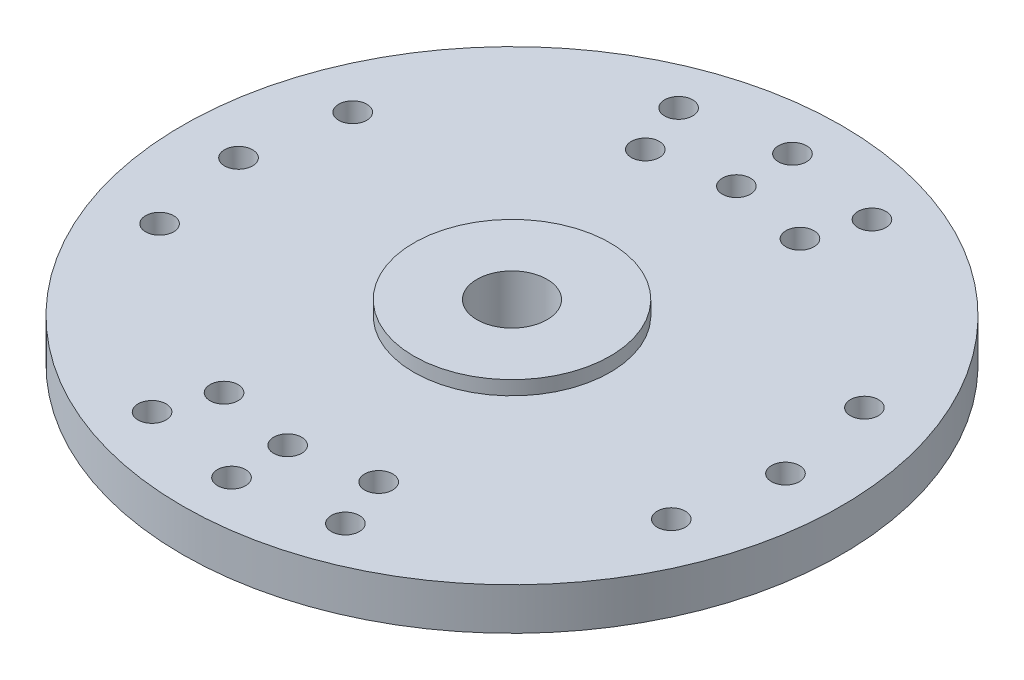
ISO-10303-21;
HEADER;
FILE_DESCRIPTION(('STEP AP214'),'2;1');
FILE_NAME('part.step','',(''),(''),'','','');
FILE_SCHEMA(('AUTOMOTIVE_DESIGN { 1 0 10303 214 1 1 1 1 }'));
ENDSEC;
DATA;
#1=APPLICATION_CONTEXT('core data for automotive mechanical design processes');
#2=APPLICATION_PROTOCOL_DEFINITION('international standard','automotive_design',2000,#1);
#3=PRODUCT_CONTEXT('',#1,'mechanical');
#4=PRODUCT('Part','Part','',(#3));
#5=PRODUCT_RELATED_PRODUCT_CATEGORY('part','',(#4));
#6=PRODUCT_DEFINITION_FORMATION('','',#4);
#7=PRODUCT_DEFINITION_CONTEXT('part definition',#1,'design');
#8=PRODUCT_DEFINITION('design','',#6,#7);
#9=PRODUCT_DEFINITION_SHAPE('','',#8);
#10=(LENGTH_UNIT() NAMED_UNIT(*) SI_UNIT(.MILLI.,.METRE.));
#11=(NAMED_UNIT(*) PLANE_ANGLE_UNIT() SI_UNIT($,.RADIAN.));
#12=(NAMED_UNIT(*) SI_UNIT($,.STERADIAN.) SOLID_ANGLE_UNIT());
#13=UNCERTAINTY_MEASURE_WITH_UNIT(LENGTH_MEASURE(1.E-05),#10,'distance_accuracy_value','');
#14=(GEOMETRIC_REPRESENTATION_CONTEXT(3) GLOBAL_UNCERTAINTY_ASSIGNED_CONTEXT((#13)) GLOBAL_UNIT_ASSIGNED_CONTEXT((#10,
#11,#12)) REPRESENTATION_CONTEXT('',''));
#15=CARTESIAN_POINT('',(0.,0.,0.));
#16=DIRECTION('',(0.,0.,1.));
#17=DIRECTION('',(1.,0.,0.));
#18=AXIS2_PLACEMENT_3D('',#15,#16,#17);
#19=CARTESIAN_POINT('',(0.,-2.3,0.));
#20=DIRECTION('',(0.,1.,0.));
#21=DIRECTION('',(0.,0.,1.));
#22=AXIS2_PLACEMENT_3D('',#19,#20,#21);
#23=CYLINDRICAL_SURFACE('',#22,1.25);
#24=CARTESIAN_POINT('',(0.,2.,0.));
#25=DIRECTION('',(0.,1.,0.));
#26=DIRECTION('',(0.,0.,1.));
#27=AXIS2_PLACEMENT_3D('',#24,#25,#26);
#28=CIRCLE('',#27,1.25);
#29=CARTESIAN_POINT('',(0.,2.,1.25));
#30=VERTEX_POINT('',#29);
#31=EDGE_CURVE('E64',#30,#30,#28,.T.);
#32=CARTESIAN_POINT('',(0.,-0.0500000000000001,0.));
#33=DIRECTION('',(0.,-1.,0.));
#34=DIRECTION('',(0.,0.,-1.));
#35=AXIS2_PLACEMENT_3D('',#32,#33,#34);
#36=CIRCLE('',#35,1.25);
#37=CARTESIAN_POINT('',(0.,-0.0500000000000001,1.25));
#38=VERTEX_POINT('',#37);
#39=EDGE_CURVE('E39',#38,#38,#36,.F.);
#40=CARTESIAN_POINT('',(0.,2.,1.25));
#41=CARTESIAN_POINT('',(0.,1.97864583333333,1.25));
#42=CARTESIAN_POINT('',(0.,1.95729166666667,1.25));
#43=CARTESIAN_POINT('',(0.,1.91458333333333,1.25));
#44=CARTESIAN_POINT('',(0.,1.89322916666667,1.25));
#45=CARTESIAN_POINT('',(0.,1.85052083333333,1.25));
#46=CARTESIAN_POINT('',(0.,1.82916666666667,1.25));
#47=CARTESIAN_POINT('',(0.,1.78645833333333,1.25));
#48=CARTESIAN_POINT('',(0.,1.76510416666667,1.25));
#49=CARTESIAN_POINT('',(0.,1.72239583333333,1.25));
#50=CARTESIAN_POINT('',(0.,1.70104166666667,1.25));
#51=CARTESIAN_POINT('',(0.,1.65833333333333,1.25));
#52=CARTESIAN_POINT('',(0.,1.63697916666667,1.25));
#53=CARTESIAN_POINT('',(0.,1.59427083333333,1.25));
#54=CARTESIAN_POINT('',(0.,1.57291666666667,1.25));
#55=CARTESIAN_POINT('',(0.,1.53020833333333,1.25));
#56=CARTESIAN_POINT('',(0.,1.50885416666667,1.25));
#57=CARTESIAN_POINT('',(0.,1.46614583333333,1.25));
#58=CARTESIAN_POINT('',(0.,1.44479166666667,1.25));
#59=CARTESIAN_POINT('',(0.,1.40208333333333,1.25));
#60=CARTESIAN_POINT('',(0.,1.38072916666667,1.25));
#61=CARTESIAN_POINT('',(0.,1.33802083333333,1.25));
#62=CARTESIAN_POINT('',(0.,1.31666666666667,1.25));
#63=CARTESIAN_POINT('',(0.,1.27395833333333,1.25));
#64=CARTESIAN_POINT('',(0.,1.25260416666667,1.25));
#65=CARTESIAN_POINT('',(0.,1.20989583333333,1.25));
#66=CARTESIAN_POINT('',(0.,1.18854166666667,1.25));
#67=CARTESIAN_POINT('',(0.,1.14583333333333,1.25));
#68=CARTESIAN_POINT('',(0.,1.12447916666667,1.25));
#69=CARTESIAN_POINT('',(0.,1.08177083333333,1.25));
#70=CARTESIAN_POINT('',(0.,1.06041666666667,1.25));
#71=CARTESIAN_POINT('',(0.,1.01770833333333,1.25));
#72=CARTESIAN_POINT('',(0.,0.996354166666666,1.25));
#73=CARTESIAN_POINT('',(0.,0.953645833333333,1.25));
#74=CARTESIAN_POINT('',(0.,0.932291666666666,1.25));
#75=CARTESIAN_POINT('',(0.,0.889583333333333,1.25));
#76=CARTESIAN_POINT('',(0.,0.868229166666667,1.25));
#77=CARTESIAN_POINT('',(0.,0.825520833333333,1.25));
#78=CARTESIAN_POINT('',(0.,0.804166666666666,1.25));
#79=CARTESIAN_POINT('',(0.,0.761458333333333,1.25));
#80=CARTESIAN_POINT('',(0.,0.740104166666666,1.25));
#81=CARTESIAN_POINT('',(0.,0.697395833333333,1.25));
#82=CARTESIAN_POINT('',(0.,0.676041666666666,1.25));
#83=CARTESIAN_POINT('',(0.,0.633333333333333,1.25));
#84=CARTESIAN_POINT('',(0.,0.611979166666666,1.25));
#85=CARTESIAN_POINT('',(0.,0.569270833333333,1.25));
#86=CARTESIAN_POINT('',(0.,0.547916666666666,1.25));
#87=CARTESIAN_POINT('',(0.,0.505208333333333,1.25));
#88=CARTESIAN_POINT('',(0.,0.483854166666666,1.25));
#89=CARTESIAN_POINT('',(0.,0.441145833333333,1.25));
#90=CARTESIAN_POINT('',(0.,0.419791666666667,1.25));
#91=CARTESIAN_POINT('',(0.,0.377083333333333,1.25));
#92=CARTESIAN_POINT('',(0.,0.355729166666667,1.25));
#93=CARTESIAN_POINT('',(0.,0.313020833333333,1.25));
#94=CARTESIAN_POINT('',(0.,0.291666666666667,1.25));
#95=CARTESIAN_POINT('',(0.,0.248958333333333,1.25));
#96=CARTESIAN_POINT('',(0.,0.227604166666666,1.25));
#97=CARTESIAN_POINT('',(0.,0.184895833333333,1.25));
#98=CARTESIAN_POINT('',(0.,0.163541666666667,1.25));
#99=CARTESIAN_POINT('',(0.,0.120833333333333,1.25));
#100=CARTESIAN_POINT('',(0.,0.0994791666666664,1.25));
#101=CARTESIAN_POINT('',(0.,0.056770833333333,1.25));
#102=CARTESIAN_POINT('',(0.,0.0354166666666664,1.25));
#103=CARTESIAN_POINT('',(0.,-0.00729166666666685,1.25));
#104=CARTESIAN_POINT('',(0.,-0.0286458333333335,1.25));
#105=CARTESIAN_POINT('',(0.,-0.0500000000000001,1.25));
#106=B_SPLINE_CURVE_WITH_KNOTS('',3,(#40,#41,#42,#43,#44,#45,#46,#47,#48,#49,#50,#51,#52,#53,
#54,#55,#56,#57,#58,#59,#60,#61,#62,#63,#64,#65,#66,#67,#68,#69,#70,#71,#72,#73,#74,#75,#76,#77,
#78,#79,#80,#81,#82,#83,#84,#85,#86,#87,#88,#89,#90,#91,#92,#93,#94,#95,#96,#97,#98,#99,#100,
#101,#102,#103,#104,#105),.UNSPECIFIED.,.F.,.F.,(4,2,2,2,2,2,2,2,2,2,2,2,2,2,2,2,2,2,2,2,2,2,2,
2,2,2,2,2,2,2,2,2,4),(0.,0.0640624999999999,0.128125,0.1921875,0.25625,0.3203125,0.384375,
0.4484375,0.5125,0.576562499999999,0.640624999999999,0.7046875,0.768749999999999,
0.832812499999999,0.896875,0.9609375,1.025,1.0890625,1.153125,1.2171875,1.28125,1.3453125,
1.409375,1.4734375,1.5375,1.6015625,1.665625,1.7296875,1.79375,1.8578125,1.921875,1.9859375,
2.05),.UNSPECIFIED.);
#107=EDGE_CURVE('BSEAM35',#30,#38,#106,.T.);
#108=ORIENTED_EDGE('',*,*,#31,.T.);
#109=ORIENTED_EDGE('',*,*,#39,.F.);
#110=ORIENTED_EDGE('',*,*,#107,.T.);
#111=ORIENTED_EDGE('',*,*,#107,.F.);
#112=EDGE_LOOP('',(#108,#110,#109,#111));
#113=FACE_BOUND('',#112,.T.);
#114=ADVANCED_FACE('F35',(#113),#23,.F.);
#115=CARTESIAN_POINT('',(0.,1.5,0.));
#116=DIRECTION('',(0.,-1.,0.));
#117=DIRECTION('',(0.,0.,-1.));
#118=AXIS2_PLACEMENT_3D('',#115,#116,#117);
#119=CYLINDRICAL_SURFACE('',#118,11.75);
#120=CARTESIAN_POINT('',(0.,1.5,0.));
#121=DIRECTION('',(0.,1.,0.));
#122=DIRECTION('',(0.,0.,1.));
#123=AXIS2_PLACEMENT_3D('',#120,#121,#122);
#124=CIRCLE('',#123,11.75);
#125=CARTESIAN_POINT('',(0.,1.5,11.75));
#126=VERTEX_POINT('',#125);
#127=EDGE_CURVE('E44',#126,#126,#124,.T.);
#128=ORIENTED_EDGE('',*,*,#127,.F.);
#129=EDGE_LOOP('',(#128));
#130=FACE_BOUND('',#129,.T.);
#131=CARTESIAN_POINT('',(0.,0.,0.));
#132=DIRECTION('',(0.,1.,0.));
#133=DIRECTION('',(0.,0.,1.));
#134=AXIS2_PLACEMENT_3D('',#131,#132,#133);
#135=CIRCLE('',#134,11.75);
#136=CARTESIAN_POINT('',(0.,0.,11.75));
#137=VERTEX_POINT('',#136);
#138=EDGE_CURVE('E51',#137,#137,#135,.T.);
#139=ORIENTED_EDGE('',*,*,#138,.T.);
#140=EDGE_LOOP('',(#139));
#141=FACE_BOUND('',#140,.T.);
#142=ADVANCED_FACE('F37',(#130,#141),#119,.T.);
#143=CARTESIAN_POINT('',(0.,1.5,0.));
#144=DIRECTION('',(0.,1.,0.));
#145=DIRECTION('',(0.,0.,1.));
#146=AXIS2_PLACEMENT_3D('',#143,#144,#145);
#147=PLANE('',#146);
#148=CARTESIAN_POINT('',(0.,1.5,10.));
#149=DIRECTION('',(0.,1.,0.));
#150=DIRECTION('',(0.,0.,1.));
#151=AXIS2_PLACEMENT_3D('',#148,#149,#150);
#152=CIRCLE('',#151,0.500000000000001);
#153=CARTESIAN_POINT('',(0.,1.5,10.5));
#154=VERTEX_POINT('',#153);
#155=EDGE_CURVE('E134',#154,#154,#152,.T.);
#156=ORIENTED_EDGE('',*,*,#155,.F.);
#157=EDGE_LOOP('',(#156));
#158=FACE_BOUND('',#157,.T.);
#159=CARTESIAN_POINT('',(-3.44598951681516,1.5,9.3875));
#160=DIRECTION('',(0.,1.,0.));
#161=DIRECTION('',(0.,0.,1.));
#162=AXIS2_PLACEMENT_3D('',#159,#160,#161);
#163=CIRCLE('',#162,0.500000000000002);
#164=CARTESIAN_POINT('',(-3.44598951681516,1.5,9.8875));
#165=VERTEX_POINT('',#164);
#166=EDGE_CURVE('E131',#165,#165,#163,.T.);
#167=ORIENTED_EDGE('',*,*,#166,.F.);
#168=EDGE_LOOP('',(#167));
#169=FACE_BOUND('',#168,.T.);
#170=CARTESIAN_POINT('',(-2.75679161345213,1.5,7.51));
#171=DIRECTION('',(0.,1.,0.));
#172=DIRECTION('',(0.,0.,1.));
#173=AXIS2_PLACEMENT_3D('',#170,#171,#172);
#174=CIRCLE('',#173,0.500000000000001);
#175=CARTESIAN_POINT('',(-2.75679161345213,1.5,8.01));
#176=VERTEX_POINT('',#175);
#177=EDGE_CURVE('E128',#176,#176,#174,.T.);
#178=ORIENTED_EDGE('',*,*,#177,.F.);
#179=EDGE_LOOP('',(#178));
#180=FACE_BOUND('',#179,.T.);
#181=CARTESIAN_POINT('',(2.75679161345213,1.5,7.51));
#182=DIRECTION('',(0.,1.,0.));
#183=DIRECTION('',(0.,0.,1.));
#184=AXIS2_PLACEMENT_3D('',#181,#182,#183);
#185=CIRCLE('',#184,0.500000000000001);
#186=CARTESIAN_POINT('',(2.75679161345213,1.5,8.01));
#187=VERTEX_POINT('',#186);
#188=EDGE_CURVE('E124',#187,#187,#185,.T.);
#189=ORIENTED_EDGE('',*,*,#188,.F.);
#190=EDGE_LOOP('',(#189));
#191=FACE_BOUND('',#190,.T.);
#192=CARTESIAN_POINT('',(3.44598951681516,1.5,9.3875));
#193=DIRECTION('',(0.,1.,0.));
#194=DIRECTION('',(0.,0.,1.));
#195=AXIS2_PLACEMENT_3D('',#192,#193,#194);
#196=CIRCLE('',#195,0.500000000000001);
#197=CARTESIAN_POINT('',(3.44598951681516,1.5,9.8875));
#198=VERTEX_POINT('',#197);
#199=EDGE_CURVE('E120',#198,#198,#196,.T.);
#200=ORIENTED_EDGE('',*,*,#199,.F.);
#201=EDGE_LOOP('',(#200));
#202=FACE_BOUND('',#201,.T.);
#203=CARTESIAN_POINT('',(0.,1.5,8.));
#204=DIRECTION('',(0.,1.,0.));
#205=DIRECTION('',(0.,0.,1.));
#206=AXIS2_PLACEMENT_3D('',#203,#204,#205);
#207=CIRCLE('',#206,0.500000000000001);
#208=CARTESIAN_POINT('',(0.,1.5,8.5));
#209=VERTEX_POINT('',#208);
#210=EDGE_CURVE('E116',#209,#209,#207,.T.);
#211=ORIENTED_EDGE('',*,*,#210,.F.);
#212=EDGE_LOOP('',(#211));
#213=FACE_BOUND('',#212,.T.);
#214=CARTESIAN_POINT('',(-9.12179487179487,1.5,-3.44316109366041));
#215=DIRECTION('',(0.,1.,0.));
#216=DIRECTION('',(0.,0.,-1.));
#217=AXIS2_PLACEMENT_3D('',#214,#215,#216);
#218=CIRCLE('',#217,0.500000000000001);
#219=CARTESIAN_POINT('',(-9.12179487179487,1.5,-3.94316109366041));
#220=VERTEX_POINT('',#219);
#221=EDGE_CURVE('E138',#220,#220,#218,.T.);
#222=ORIENTED_EDGE('',*,*,#221,.F.);
#223=EDGE_LOOP('',(#222));
#224=FACE_BOUND('',#223,.T.);
#225=CARTESIAN_POINT('',(-9.12179487179487,1.5,3.44316109366041));
#226=DIRECTION('',(0.,1.,0.));
#227=DIRECTION('',(0.,0.,-1.));
#228=AXIS2_PLACEMENT_3D('',#225,#226,#227);
#229=CIRCLE('',#228,0.500000000000001);
#230=CARTESIAN_POINT('',(-9.12179487179487,1.5,2.94316109366041));
#231=VERTEX_POINT('',#230);
#232=EDGE_CURVE('E147',#231,#231,#229,.T.);
#233=ORIENTED_EDGE('',*,*,#232,.F.);
#234=EDGE_LOOP('',(#233));
#235=FACE_BOUND('',#234,.T.);
#236=CARTESIAN_POINT('',(-9.75,1.5,0.));
#237=DIRECTION('',(0.,1.,0.));
#238=DIRECTION('',(0.,0.,-1.));
#239=AXIS2_PLACEMENT_3D('',#236,#237,#238);
#240=CIRCLE('',#239,0.500000000000001);
#241=CARTESIAN_POINT('',(-9.75,1.5,-0.500000000000001));
#242=VERTEX_POINT('',#241);
#243=EDGE_CURVE('E107',#242,#242,#240,.T.);
#244=ORIENTED_EDGE('',*,*,#243,.F.);
#245=EDGE_LOOP('',(#244));
#246=FACE_BOUND('',#245,.T.);
#247=CARTESIAN_POINT('',(0.,1.5,-10.));
#248=DIRECTION('',(0.,1.,0.));
#249=DIRECTION('',(0.,0.,1.));
#250=AXIS2_PLACEMENT_3D('',#247,#248,#249);
#251=CIRCLE('',#250,0.500000000000001);
#252=CARTESIAN_POINT('',(0.,1.5,-9.5));
#253=VERTEX_POINT('',#252);
#254=EDGE_CURVE('E101',#253,#253,#251,.T.);
#255=ORIENTED_EDGE('',*,*,#254,.F.);
#256=EDGE_LOOP('',(#255));
#257=FACE_BOUND('',#256,.T.);
#258=CARTESIAN_POINT('',(3.44598951681516,1.5,-9.3875));
#259=DIRECTION('',(0.,1.,0.));
#260=DIRECTION('',(0.,0.,1.));
#261=AXIS2_PLACEMENT_3D('',#258,#259,#260);
#262=CIRCLE('',#261,0.500000000000002);
#263=CARTESIAN_POINT('',(3.44598951681516,1.5,-8.8875));
#264=VERTEX_POINT('',#263);
#265=EDGE_CURVE('E97',#264,#264,#262,.T.);
#266=ORIENTED_EDGE('',*,*,#265,.F.);
#267=EDGE_LOOP('',(#266));
#268=FACE_BOUND('',#267,.T.);
#269=CARTESIAN_POINT('',(2.75679161345213,1.5,-7.51));
#270=DIRECTION('',(0.,1.,0.));
#271=DIRECTION('',(0.,0.,1.));
#272=AXIS2_PLACEMENT_3D('',#269,#270,#271);
#273=CIRCLE('',#272,0.500000000000001);
#274=CARTESIAN_POINT('',(2.75679161345213,1.5,-7.01));
#275=VERTEX_POINT('',#274);
#276=EDGE_CURVE('E93',#275,#275,#273,.T.);
#277=ORIENTED_EDGE('',*,*,#276,.F.);
#278=EDGE_LOOP('',(#277));
#279=FACE_BOUND('',#278,.T.);
#280=CARTESIAN_POINT('',(-2.75679161345213,1.5,-7.51));
#281=DIRECTION('',(0.,1.,0.));
#282=DIRECTION('',(0.,0.,1.));
#283=AXIS2_PLACEMENT_3D('',#280,#281,#282);
#284=CIRCLE('',#283,0.500000000000001);
#285=CARTESIAN_POINT('',(-2.75679161345213,1.5,-7.01));
#286=VERTEX_POINT('',#285);
#287=EDGE_CURVE('E89',#286,#286,#284,.T.);
#288=ORIENTED_EDGE('',*,*,#287,.F.);
#289=EDGE_LOOP('',(#288));
#290=FACE_BOUND('',#289,.T.);
#291=CARTESIAN_POINT('',(-3.44598951681516,1.5,-9.3875));
#292=DIRECTION('',(0.,1.,0.));
#293=DIRECTION('',(0.,0.,1.));
#294=AXIS2_PLACEMENT_3D('',#291,#292,#293);
#295=CIRCLE('',#294,0.500000000000001);
#296=CARTESIAN_POINT('',(-3.44598951681516,1.5,-8.8875));
#297=VERTEX_POINT('',#296);
#298=EDGE_CURVE('E85',#297,#297,#295,.T.);
#299=ORIENTED_EDGE('',*,*,#298,.F.);
#300=EDGE_LOOP('',(#299));
#301=FACE_BOUND('',#300,.T.);
#302=CARTESIAN_POINT('',(0.,1.5,-8.));
#303=DIRECTION('',(0.,1.,0.));
#304=DIRECTION('',(0.,0.,1.));
#305=AXIS2_PLACEMENT_3D('',#302,#303,#304);
#306=CIRCLE('',#305,0.500000000000001);
#307=CARTESIAN_POINT('',(0.,1.5,-7.5));
#308=VERTEX_POINT('',#307);
#309=EDGE_CURVE('E80',#308,#308,#306,.T.);
#310=ORIENTED_EDGE('',*,*,#309,.F.);
#311=EDGE_LOOP('',(#310));
#312=FACE_BOUND('',#311,.T.);
#313=CARTESIAN_POINT('',(9.12179487179487,1.5,3.44316109366041));
#314=DIRECTION('',(0.,1.,0.));
#315=DIRECTION('',(0.,0.,1.));
#316=AXIS2_PLACEMENT_3D('',#313,#314,#315);
#317=CIRCLE('',#316,0.500000000000001);
#318=CARTESIAN_POINT('',(9.12179487179487,1.5,3.94316109366041));
#319=VERTEX_POINT('',#318);
#320=EDGE_CURVE('E167',#319,#319,#317,.T.);
#321=ORIENTED_EDGE('',*,*,#320,.F.);
#322=EDGE_LOOP('',(#321));
#323=FACE_BOUND('',#322,.T.);
#324=CARTESIAN_POINT('',(9.12179487179487,1.5,-3.44316109366041));
#325=DIRECTION('',(0.,1.,0.));
#326=DIRECTION('',(0.,0.,1.));
#327=AXIS2_PLACEMENT_3D('',#324,#325,#326);
#328=CIRCLE('',#327,0.500000000000001);
#329=CARTESIAN_POINT('',(9.12179487179487,1.5,-2.94316109366041));
#330=VERTEX_POINT('',#329);
#331=EDGE_CURVE('E168',#330,#330,#328,.T.);
#332=ORIENTED_EDGE('',*,*,#331,.F.);
#333=EDGE_LOOP('',(#332));
#334=FACE_BOUND('',#333,.T.);
#335=CARTESIAN_POINT('',(9.75,1.5,0.));
#336=DIRECTION('',(0.,1.,0.));
#337=DIRECTION('',(0.,0.,1.));
#338=AXIS2_PLACEMENT_3D('',#335,#336,#337);
#339=CIRCLE('',#338,0.500000000000001);
#340=CARTESIAN_POINT('',(9.75,1.5,0.500000000000001));
#341=VERTEX_POINT('',#340);
#342=EDGE_CURVE('E72',#341,#341,#339,.T.);
#343=ORIENTED_EDGE('',*,*,#342,.F.);
#344=EDGE_LOOP('',(#343));
#345=FACE_BOUND('',#344,.T.);
#346=CARTESIAN_POINT('',(0.,1.5,0.));
#347=DIRECTION('',(0.,1.,0.));
#348=DIRECTION('',(0.,0.,1.));
#349=AXIS2_PLACEMENT_3D('',#346,#347,#348);
#350=CIRCLE('',#349,3.5);
#351=CARTESIAN_POINT('',(0.,1.5,3.5));
#352=VERTEX_POINT('',#351);
#353=EDGE_CURVE('E10',#352,#352,#350,.T.);
#354=ORIENTED_EDGE('',*,*,#353,.F.);
#355=EDGE_LOOP('',(#354));
#356=FACE_BOUND('',#355,.T.);
#357=ORIENTED_EDGE('',*,*,#127,.T.);
#358=EDGE_LOOP('',(#357));
#359=FACE_BOUND('',#358,.T.);
#360=ADVANCED_FACE('F203',(#158,#169,#180,#191,#202,#213,#224,#235,#246,#257,#268,#279,#290,
#301,#312,#323,#334,#345,#356,#359),#147,.T.);
#361=CARTESIAN_POINT('',(0.,0.,0.));
#362=DIRECTION('',(0.,1.,0.));
#363=DIRECTION('',(0.,0.,1.));
#364=AXIS2_PLACEMENT_3D('',#361,#362,#363);
#365=PLANE('',#364);
#366=CARTESIAN_POINT('',(0.,0.,10.));
#367=DIRECTION('',(0.,1.,0.));
#368=DIRECTION('',(0.,0.,1.));
#369=AXIS2_PLACEMENT_3D('',#366,#367,#368);
#370=CIRCLE('',#369,0.500000000000001);
#371=CARTESIAN_POINT('',(0.,0.,10.5));
#372=VERTEX_POINT('',#371);
#373=EDGE_CURVE('E132',#372,#372,#370,.T.);
#374=ORIENTED_EDGE('',*,*,#373,.T.);
#375=EDGE_LOOP('',(#374));
#376=FACE_BOUND('',#375,.T.);
#377=CARTESIAN_POINT('',(-3.44598951681516,0.,9.3875));
#378=DIRECTION('',(0.,1.,0.));
#379=DIRECTION('',(0.,0.,1.));
#380=AXIS2_PLACEMENT_3D('',#377,#378,#379);
#381=CIRCLE('',#380,0.500000000000002);
#382=CARTESIAN_POINT('',(-3.44598951681516,0.,9.8875));
#383=VERTEX_POINT('',#382);
#384=EDGE_CURVE('E129',#383,#383,#381,.T.);
#385=ORIENTED_EDGE('',*,*,#384,.T.);
#386=EDGE_LOOP('',(#385));
#387=FACE_BOUND('',#386,.T.);
#388=CARTESIAN_POINT('',(-2.75679161345213,0.,7.51));
#389=DIRECTION('',(0.,1.,0.));
#390=DIRECTION('',(0.,0.,1.));
#391=AXIS2_PLACEMENT_3D('',#388,#389,#390);
#392=CIRCLE('',#391,0.500000000000001);
#393=CARTESIAN_POINT('',(-2.75679161345213,0.,8.01));
#394=VERTEX_POINT('',#393);
#395=EDGE_CURVE('E125',#394,#394,#392,.T.);
#396=ORIENTED_EDGE('',*,*,#395,.T.);
#397=EDGE_LOOP('',(#396));
#398=FACE_BOUND('',#397,.T.);
#399=CARTESIAN_POINT('',(2.75679161345213,0.,7.51));
#400=DIRECTION('',(0.,1.,0.));
#401=DIRECTION('',(0.,0.,1.));
#402=AXIS2_PLACEMENT_3D('',#399,#400,#401);
#403=CIRCLE('',#402,0.500000000000001);
#404=CARTESIAN_POINT('',(2.75679161345213,0.,8.01));
#405=VERTEX_POINT('',#404);
#406=EDGE_CURVE('E121',#405,#405,#403,.T.);
#407=ORIENTED_EDGE('',*,*,#406,.T.);
#408=EDGE_LOOP('',(#407));
#409=FACE_BOUND('',#408,.T.);
#410=CARTESIAN_POINT('',(3.44598951681516,0.,9.3875));
#411=DIRECTION('',(0.,1.,0.));
#412=DIRECTION('',(0.,0.,1.));
#413=AXIS2_PLACEMENT_3D('',#410,#411,#412);
#414=CIRCLE('',#413,0.500000000000001);
#415=CARTESIAN_POINT('',(3.44598951681516,0.,9.8875));
#416=VERTEX_POINT('',#415);
#417=EDGE_CURVE('E117',#416,#416,#414,.T.);
#418=ORIENTED_EDGE('',*,*,#417,.T.);
#419=EDGE_LOOP('',(#418));
#420=FACE_BOUND('',#419,.T.);
#421=CARTESIAN_POINT('',(0.,0.,8.));
#422=DIRECTION('',(0.,1.,0.));
#423=DIRECTION('',(0.,0.,1.));
#424=AXIS2_PLACEMENT_3D('',#421,#422,#423);
#425=CIRCLE('',#424,0.500000000000001);
#426=CARTESIAN_POINT('',(0.,0.,8.5));
#427=VERTEX_POINT('',#426);
#428=EDGE_CURVE('E113',#427,#427,#425,.T.);
#429=ORIENTED_EDGE('',*,*,#428,.T.);
#430=EDGE_LOOP('',(#429));
#431=FACE_BOUND('',#430,.T.);
#432=CARTESIAN_POINT('',(-9.12179487179487,0.,-3.44316109366041));
#433=DIRECTION('',(0.,1.,0.));
#434=DIRECTION('',(0.,0.,1.));
#435=AXIS2_PLACEMENT_3D('',#432,#433,#434);
#436=CIRCLE('',#435,0.500000000000001);
#437=CARTESIAN_POINT('',(-9.12179487179487,0.,-2.94316109366041));
#438=VERTEX_POINT('',#437);
#439=EDGE_CURVE('E81',#438,#438,#436,.T.);
#440=ORIENTED_EDGE('',*,*,#439,.T.);
#441=EDGE_LOOP('',(#440));
#442=FACE_BOUND('',#441,.T.);
#443=CARTESIAN_POINT('',(-9.12179487179487,0.,3.44316109366041));
#444=DIRECTION('',(0.,1.,0.));
#445=DIRECTION('',(0.,0.,1.));
#446=AXIS2_PLACEMENT_3D('',#443,#444,#445);
#447=CIRCLE('',#446,0.500000000000001);
#448=CARTESIAN_POINT('',(-9.12179487179487,0.,3.94316109366041));
#449=VERTEX_POINT('',#448);
#450=EDGE_CURVE('E106',#449,#449,#447,.T.);
#451=ORIENTED_EDGE('',*,*,#450,.T.);
#452=EDGE_LOOP('',(#451));
#453=FACE_BOUND('',#452,.T.);
#454=CARTESIAN_POINT('',(-9.75,0.,0.));
#455=DIRECTION('',(0.,1.,0.));
#456=DIRECTION('',(0.,0.,1.));
#457=AXIS2_PLACEMENT_3D('',#454,#455,#456);
#458=CIRCLE('',#457,0.500000000000001);
#459=CARTESIAN_POINT('',(-9.75,0.,0.500000000000001));
#460=VERTEX_POINT('',#459);
#461=EDGE_CURVE('E102',#460,#460,#458,.T.);
#462=ORIENTED_EDGE('',*,*,#461,.T.);
#463=EDGE_LOOP('',(#462));
#464=FACE_BOUND('',#463,.T.);
#465=CARTESIAN_POINT('',(0.,0.,-10.));
#466=DIRECTION('',(0.,1.,0.));
#467=DIRECTION('',(0.,0.,1.));
#468=AXIS2_PLACEMENT_3D('',#465,#466,#467);
#469=CIRCLE('',#468,0.500000000000001);
#470=CARTESIAN_POINT('',(0.,0.,-9.5));
#471=VERTEX_POINT('',#470);
#472=EDGE_CURVE('E98',#471,#471,#469,.T.);
#473=ORIENTED_EDGE('',*,*,#472,.T.);
#474=EDGE_LOOP('',(#473));
#475=FACE_BOUND('',#474,.T.);
#476=CARTESIAN_POINT('',(3.44598951681516,0.,-9.3875));
#477=DIRECTION('',(0.,1.,0.));
#478=DIRECTION('',(0.,0.,1.));
#479=AXIS2_PLACEMENT_3D('',#476,#477,#478);
#480=CIRCLE('',#479,0.500000000000002);
#481=CARTESIAN_POINT('',(3.44598951681516,0.,-8.8875));
#482=VERTEX_POINT('',#481);
#483=EDGE_CURVE('E94',#482,#482,#480,.T.);
#484=ORIENTED_EDGE('',*,*,#483,.T.);
#485=EDGE_LOOP('',(#484));
#486=FACE_BOUND('',#485,.T.);
#487=CARTESIAN_POINT('',(2.75679161345213,0.,-7.51));
#488=DIRECTION('',(0.,1.,0.));
#489=DIRECTION('',(0.,0.,1.));
#490=AXIS2_PLACEMENT_3D('',#487,#488,#489);
#491=CIRCLE('',#490,0.500000000000001);
#492=CARTESIAN_POINT('',(2.75679161345213,0.,-7.01));
#493=VERTEX_POINT('',#492);
#494=EDGE_CURVE('E90',#493,#493,#491,.T.);
#495=ORIENTED_EDGE('',*,*,#494,.T.);
#496=EDGE_LOOP('',(#495));
#497=FACE_BOUND('',#496,.T.);
#498=CARTESIAN_POINT('',(-2.75679161345213,0.,-7.51));
#499=DIRECTION('',(0.,1.,0.));
#500=DIRECTION('',(0.,0.,1.));
#501=AXIS2_PLACEMENT_3D('',#498,#499,#500);
#502=CIRCLE('',#501,0.500000000000001);
#503=CARTESIAN_POINT('',(-2.75679161345213,0.,-7.01));
#504=VERTEX_POINT('',#503);
#505=EDGE_CURVE('E86',#504,#504,#502,.T.);
#506=ORIENTED_EDGE('',*,*,#505,.T.);
#507=EDGE_LOOP('',(#506));
#508=FACE_BOUND('',#507,.T.);
#509=CARTESIAN_POINT('',(-3.44598951681516,0.,-9.3875));
#510=DIRECTION('',(0.,1.,0.));
#511=DIRECTION('',(0.,0.,1.));
#512=AXIS2_PLACEMENT_3D('',#509,#510,#511);
#513=CIRCLE('',#512,0.500000000000001);
#514=CARTESIAN_POINT('',(-3.44598951681516,0.,-8.8875));
#515=VERTEX_POINT('',#514);
#516=EDGE_CURVE('E82',#515,#515,#513,.T.);
#517=ORIENTED_EDGE('',*,*,#516,.T.);
#518=EDGE_LOOP('',(#517));
#519=FACE_BOUND('',#518,.T.);
#520=CARTESIAN_POINT('',(0.,0.,-8.));
#521=DIRECTION('',(0.,1.,0.));
#522=DIRECTION('',(0.,0.,1.));
#523=AXIS2_PLACEMENT_3D('',#520,#521,#522);
#524=CIRCLE('',#523,0.500000000000001);
#525=CARTESIAN_POINT('',(0.,0.,-7.5));
#526=VERTEX_POINT('',#525);
#527=EDGE_CURVE('E77',#526,#526,#524,.T.);
#528=ORIENTED_EDGE('',*,*,#527,.T.);
#529=EDGE_LOOP('',(#528));
#530=FACE_BOUND('',#529,.T.);
#531=CARTESIAN_POINT('',(9.12179487179487,0.,3.44316109366041));
#532=DIRECTION('',(0.,1.,0.));
#533=DIRECTION('',(0.,0.,1.));
#534=AXIS2_PLACEMENT_3D('',#531,#532,#533);
#535=CIRCLE('',#534,0.500000000000001);
#536=CARTESIAN_POINT('',(9.12179487179487,0.,3.94316109366041));
#537=VERTEX_POINT('',#536);
#538=EDGE_CURVE('E67',#537,#537,#535,.T.);
#539=ORIENTED_EDGE('',*,*,#538,.T.);
#540=EDGE_LOOP('',(#539));
#541=FACE_BOUND('',#540,.T.);
#542=CARTESIAN_POINT('',(9.12179487179487,0.,-3.44316109366041));
#543=DIRECTION('',(0.,1.,0.));
#544=DIRECTION('',(0.,0.,1.));
#545=AXIS2_PLACEMENT_3D('',#542,#543,#544);
#546=CIRCLE('',#545,0.500000000000001);
#547=CARTESIAN_POINT('',(9.12179487179487,0.,-2.94316109366041));
#548=VERTEX_POINT('',#547);
#549=EDGE_CURVE('E71',#548,#548,#546,.T.);
#550=ORIENTED_EDGE('',*,*,#549,.T.);
#551=EDGE_LOOP('',(#550));
#552=FACE_BOUND('',#551,.T.);
#553=CARTESIAN_POINT('',(9.75,0.,0.));
#554=DIRECTION('',(0.,1.,0.));
#555=DIRECTION('',(0.,0.,1.));
#556=AXIS2_PLACEMENT_3D('',#553,#554,#555);
#557=CIRCLE('',#556,0.500000000000001);
#558=CARTESIAN_POINT('',(9.75,0.,0.500000000000001));
#559=VERTEX_POINT('',#558);
#560=EDGE_CURVE('E68',#559,#559,#557,.T.);
#561=ORIENTED_EDGE('',*,*,#560,.T.);
#562=EDGE_LOOP('',(#561));
#563=FACE_BOUND('',#562,.T.);
#564=CARTESIAN_POINT('',(0.,0.,0.));
#565=DIRECTION('',(0.,1.,0.));
#566=DIRECTION('',(0.,0.,1.));
#567=AXIS2_PLACEMENT_3D('',#564,#565,#566);
#568=CIRCLE('',#567,3.5);
#569=CARTESIAN_POINT('',(0.,0.,3.5));
#570=VERTEX_POINT('',#569);
#571=EDGE_CURVE('E60',#570,#570,#568,.T.);
#572=ORIENTED_EDGE('',*,*,#571,.T.);
#573=EDGE_LOOP('',(#572));
#574=FACE_BOUND('',#573,.T.);
#575=ORIENTED_EDGE('',*,*,#138,.F.);
#576=EDGE_LOOP('',(#575));
#577=FACE_BOUND('',#576,.T.);
#578=ADVANCED_FACE('F210',(#376,#387,#398,#409,#420,#431,#442,#453,#464,#475,#486,#497,#508,
#519,#530,#541,#552,#563,#574,#577),#365,.F.);
#579=CARTESIAN_POINT('',(0.,-2.3,0.));
#580=DIRECTION('',(0.,1.,0.));
#581=DIRECTION('',(0.,0.,1.));
#582=AXIS2_PLACEMENT_3D('',#579,#580,#581);
#583=PLANE('',#582);
#584=CARTESIAN_POINT('',(0.,-2.3,0.));
#585=DIRECTION('',(0.,-1.,0.));
#586=DIRECTION('',(0.,0.,-1.));
#587=AXIS2_PLACEMENT_3D('',#584,#585,#586);
#588=CIRCLE('',#587,2.375);
#589=CARTESIAN_POINT('',(0.,-2.3,-2.375));
#590=VERTEX_POINT('',#589);
#591=EDGE_CURVE('E218',#590,#590,#588,.T.);
#592=ORIENTED_EDGE('',*,*,#591,.F.);
#593=EDGE_LOOP('',(#592));
#594=FACE_BOUND('',#593,.T.);
#595=CARTESIAN_POINT('',(0.,-2.3,0.));
#596=DIRECTION('',(0.,1.,0.));
#597=DIRECTION('',(0.,0.,1.));
#598=AXIS2_PLACEMENT_3D('',#595,#596,#597);
#599=CIRCLE('',#598,3.5);
#600=CARTESIAN_POINT('',(0.,-2.3,3.5));
#601=VERTEX_POINT('',#600);
#602=EDGE_CURVE('E63',#601,#601,#599,.T.);
#603=ORIENTED_EDGE('',*,*,#602,.F.);
#604=EDGE_LOOP('',(#603));
#605=FACE_BOUND('',#604,.T.);
#606=ADVANCED_FACE('F195',(#594,#605),#583,.F.);
#607=CARTESIAN_POINT('',(0.,-2.3,0.));
#608=DIRECTION('',(0.,1.,0.));
#609=DIRECTION('',(0.,0.,1.));
#610=AXIS2_PLACEMENT_3D('',#607,#608,#609);
#611=CYLINDRICAL_SURFACE('',#610,3.5);
#612=CARTESIAN_POINT('',(0.,-2.3,3.5));
#613=CARTESIAN_POINT('',(0.,-2.27604166666667,3.5));
#614=CARTESIAN_POINT('',(0.,-2.25208333333333,3.5));
#615=CARTESIAN_POINT('',(0.,-2.20416666666667,3.5));
#616=CARTESIAN_POINT('',(0.,-2.18020833333333,3.5));
#617=CARTESIAN_POINT('',(0.,-2.13229166666667,3.5));
#618=CARTESIAN_POINT('',(0.,-2.10833333333333,3.5));
#619=CARTESIAN_POINT('',(0.,-2.06041666666667,3.5));
#620=CARTESIAN_POINT('',(0.,-2.03645833333333,3.5));
#621=CARTESIAN_POINT('',(0.,-1.98854166666667,3.5));
#622=CARTESIAN_POINT('',(0.,-1.96458333333333,3.5));
#623=CARTESIAN_POINT('',(0.,-1.91666666666667,3.5));
#624=CARTESIAN_POINT('',(0.,-1.89270833333333,3.5));
#625=CARTESIAN_POINT('',(0.,-1.84479166666667,3.5));
#626=CARTESIAN_POINT('',(0.,-1.82083333333333,3.5));
#627=CARTESIAN_POINT('',(0.,-1.77291666666667,3.5));
#628=CARTESIAN_POINT('',(0.,-1.74895833333333,3.5));
#629=CARTESIAN_POINT('',(0.,-1.70104166666667,3.5));
#630=CARTESIAN_POINT('',(0.,-1.67708333333333,3.5));
#631=CARTESIAN_POINT('',(0.,-1.62916666666667,3.5));
#632=CARTESIAN_POINT('',(0.,-1.60520833333333,3.5));
#633=CARTESIAN_POINT('',(0.,-1.55729166666667,3.5));
#634=CARTESIAN_POINT('',(0.,-1.53333333333333,3.5));
#635=CARTESIAN_POINT('',(0.,-1.48541666666667,3.5));
#636=CARTESIAN_POINT('',(0.,-1.46145833333333,3.5));
#637=CARTESIAN_POINT('',(0.,-1.41354166666667,3.5));
#638=CARTESIAN_POINT('',(0.,-1.38958333333333,3.5));
#639=CARTESIAN_POINT('',(0.,-1.34166666666667,3.5));
#640=CARTESIAN_POINT('',(0.,-1.31770833333333,3.5));
#641=CARTESIAN_POINT('',(0.,-1.26979166666667,3.5));
#642=CARTESIAN_POINT('',(0.,-1.24583333333333,3.5));
#643=CARTESIAN_POINT('',(0.,-1.19791666666667,3.5));
#644=CARTESIAN_POINT('',(0.,-1.17395833333333,3.5));
#645=CARTESIAN_POINT('',(0.,-1.12604166666667,3.5));
#646=CARTESIAN_POINT('',(0.,-1.10208333333333,3.5));
#647=CARTESIAN_POINT('',(0.,-1.05416666666667,3.5));
#648=CARTESIAN_POINT('',(0.,-1.03020833333333,3.5));
#649=CARTESIAN_POINT('',(0.,-0.982291666666667,3.5));
#650=CARTESIAN_POINT('',(0.,-0.958333333333334,3.5));
#651=CARTESIAN_POINT('',(0.,-0.910416666666667,3.5));
#652=CARTESIAN_POINT('',(0.,-0.886458333333334,3.5));
#653=CARTESIAN_POINT('',(0.,-0.838541666666667,3.5));
#654=CARTESIAN_POINT('',(0.,-0.814583333333334,3.5));
#655=CARTESIAN_POINT('',(0.,-0.766666666666667,3.5));
#656=CARTESIAN_POINT('',(0.,-0.742708333333334,3.5));
#657=CARTESIAN_POINT('',(0.,-0.694791666666667,3.5));
#658=CARTESIAN_POINT('',(0.,-0.670833333333334,3.5));
#659=CARTESIAN_POINT('',(0.,-0.622916666666667,3.5));
#660=CARTESIAN_POINT('',(0.,-0.598958333333334,3.5));
#661=CARTESIAN_POINT('',(0.,-0.551041666666667,3.5));
#662=CARTESIAN_POINT('',(0.,-0.527083333333334,3.5));
#663=CARTESIAN_POINT('',(0.,-0.479166666666667,3.5));
#664=CARTESIAN_POINT('',(0.,-0.455208333333334,3.5));
#665=CARTESIAN_POINT('',(0.,-0.407291666666667,3.5));
#666=CARTESIAN_POINT('',(0.,-0.383333333333334,3.5));
#667=CARTESIAN_POINT('',(0.,-0.335416666666667,3.5));
#668=CARTESIAN_POINT('',(0.,-0.311458333333334,3.5));
#669=CARTESIAN_POINT('',(0.,-0.263541666666667,3.5));
#670=CARTESIAN_POINT('',(0.,-0.239583333333334,3.5));
#671=CARTESIAN_POINT('',(0.,-0.191666666666667,3.5));
#672=CARTESIAN_POINT('',(0.,-0.167708333333334,3.5));
#673=CARTESIAN_POINT('',(0.,-0.119791666666667,3.5));
#674=CARTESIAN_POINT('',(0.,-0.0958333333333336,3.5));
#675=CARTESIAN_POINT('',(0.,-0.047916666666667,3.5));
#676=CARTESIAN_POINT('',(0.,-0.0239583333333337,3.5));
#677=CARTESIAN_POINT('',(0.,0.,3.5));
#678=B_SPLINE_CURVE_WITH_KNOTS('',3,(#612,#613,#614,#615,#616,#617,#618,#619,#620,#621,#622,
#623,#624,#625,#626,#627,#628,#629,#630,#631,#632,#633,#634,#635,#636,#637,#638,#639,#640,#641,
#642,#643,#644,#645,#646,#647,#648,#649,#650,#651,#652,#653,#654,#655,#656,#657,#658,#659,#660,
#661,#662,#663,#664,#665,#666,#667,#668,#669,#670,#671,#672,#673,#674,#675,#676,#677),
.UNSPECIFIED.,.F.,.F.,(4,2,2,2,2,2,2,2,2,2,2,2,2,2,2,2,2,2,2,2,2,2,2,2,2,2,2,2,2,2,2,2,4),(0.,
0.0718749999999999,0.14375,0.215625,0.2875,0.359375,0.43125,0.503125,0.575,0.646875,0.71875,
0.790625,0.8625,0.934375,1.00625,1.078125,1.15,1.221875,1.29375,1.365625,1.4375,1.509375,
1.58125,1.653125,1.725,1.796875,1.86875,1.940625,2.0125,2.084375,2.15625,2.228125,2.3),.UNSPECIFIED.);
#679=EDGE_CURVE('BSEAM186',#601,#570,#678,.T.);
#680=ORIENTED_EDGE('',*,*,#602,.T.);
#681=ORIENTED_EDGE('',*,*,#571,.F.);
#682=ORIENTED_EDGE('',*,*,#679,.T.);
#683=ORIENTED_EDGE('',*,*,#679,.F.);
#684=EDGE_LOOP('',(#680,#682,#681,#683));
#685=FACE_BOUND('',#684,.T.);
#686=ADVANCED_FACE('F186',(#685),#611,.T.);
#687=CARTESIAN_POINT('',(0.,2.,0.));
#688=DIRECTION('',(0.,1.,0.));
#689=DIRECTION('',(0.,0.,1.));
#690=AXIS2_PLACEMENT_3D('',#687,#688,#689);
#691=CIRCLE('',#690,3.5);
#692=CARTESIAN_POINT('',(0.,2.,3.5));
#693=VERTEX_POINT('',#692);
#694=EDGE_CURVE('E54',#693,#693,#691,.T.);
#695=CARTESIAN_POINT('',(0.,1.5,3.5));
#696=CARTESIAN_POINT('',(0.,1.50520833333333,3.5));
#697=CARTESIAN_POINT('',(0.,1.51041666666667,3.5));
#698=CARTESIAN_POINT('',(0.,1.52083333333333,3.5));
#699=CARTESIAN_POINT('',(0.,1.52604166666667,3.5));
#700=CARTESIAN_POINT('',(0.,1.53645833333333,3.5));
#701=CARTESIAN_POINT('',(0.,1.54166666666667,3.5));
#702=CARTESIAN_POINT('',(0.,1.55208333333333,3.5));
#703=CARTESIAN_POINT('',(0.,1.55729166666667,3.5));
#704=CARTESIAN_POINT('',(0.,1.56770833333333,3.5));
#705=CARTESIAN_POINT('',(0.,1.57291666666667,3.5));
#706=CARTESIAN_POINT('',(0.,1.58333333333333,3.5));
#707=CARTESIAN_POINT('',(0.,1.58854166666667,3.5));
#708=CARTESIAN_POINT('',(0.,1.59895833333333,3.5));
#709=CARTESIAN_POINT('',(0.,1.60416666666667,3.5));
#710=CARTESIAN_POINT('',(0.,1.61458333333333,3.5));
#711=CARTESIAN_POINT('',(0.,1.61979166666667,3.5));
#712=CARTESIAN_POINT('',(0.,1.63020833333333,3.5));
#713=CARTESIAN_POINT('',(0.,1.63541666666667,3.5));
#714=CARTESIAN_POINT('',(0.,1.64583333333333,3.5));
#715=CARTESIAN_POINT('',(0.,1.65104166666667,3.5));
#716=CARTESIAN_POINT('',(0.,1.66145833333333,3.5));
#717=CARTESIAN_POINT('',(0.,1.66666666666667,3.5));
#718=CARTESIAN_POINT('',(0.,1.67708333333333,3.5));
#719=CARTESIAN_POINT('',(0.,1.68229166666667,3.5));
#720=CARTESIAN_POINT('',(0.,1.69270833333333,3.5));
#721=CARTESIAN_POINT('',(0.,1.69791666666667,3.5));
#722=CARTESIAN_POINT('',(0.,1.70833333333333,3.5));
#723=CARTESIAN_POINT('',(0.,1.71354166666667,3.5));
#724=CARTESIAN_POINT('',(0.,1.72395833333333,3.5));
#725=CARTESIAN_POINT('',(0.,1.72916666666667,3.5));
#726=CARTESIAN_POINT('',(0.,1.73958333333333,3.5));
#727=CARTESIAN_POINT('',(0.,1.74479166666667,3.5));
#728=CARTESIAN_POINT('',(0.,1.75520833333333,3.5));
#729=CARTESIAN_POINT('',(0.,1.76041666666667,3.5));
#730=CARTESIAN_POINT('',(0.,1.77083333333333,3.5));
#731=CARTESIAN_POINT('',(0.,1.77604166666667,3.5));
#732=CARTESIAN_POINT('',(0.,1.78645833333333,3.5));
#733=CARTESIAN_POINT('',(0.,1.79166666666667,3.5));
#734=CARTESIAN_POINT('',(0.,1.80208333333333,3.5));
#735=CARTESIAN_POINT('',(0.,1.80729166666667,3.5));
#736=CARTESIAN_POINT('',(0.,1.81770833333333,3.5));
#737=CARTESIAN_POINT('',(0.,1.82291666666667,3.5));
#738=CARTESIAN_POINT('',(0.,1.83333333333333,3.5));
#739=CARTESIAN_POINT('',(0.,1.83854166666667,3.5));
#740=CARTESIAN_POINT('',(0.,1.84895833333333,3.5));
#741=CARTESIAN_POINT('',(0.,1.85416666666667,3.5));
#742=CARTESIAN_POINT('',(0.,1.86458333333333,3.5));
#743=CARTESIAN_POINT('',(0.,1.86979166666667,3.5));
#744=CARTESIAN_POINT('',(0.,1.88020833333333,3.5));
#745=CARTESIAN_POINT('',(0.,1.88541666666667,3.5));
#746=CARTESIAN_POINT('',(0.,1.89583333333333,3.5));
#747=CARTESIAN_POINT('',(0.,1.90104166666667,3.5));
#748=CARTESIAN_POINT('',(0.,1.91145833333333,3.5));
#749=CARTESIAN_POINT('',(0.,1.91666666666667,3.5));
#750=CARTESIAN_POINT('',(0.,1.92708333333333,3.5));
#751=CARTESIAN_POINT('',(0.,1.93229166666667,3.5));
#752=CARTESIAN_POINT('',(0.,1.94270833333333,3.5));
#753=CARTESIAN_POINT('',(0.,1.94791666666667,3.5));
#754=CARTESIAN_POINT('',(0.,1.95833333333333,3.5));
#755=CARTESIAN_POINT('',(0.,1.96354166666667,3.5));
#756=CARTESIAN_POINT('',(0.,1.97395833333333,3.5));
#757=CARTESIAN_POINT('',(0.,1.97916666666667,3.5));
#758=CARTESIAN_POINT('',(0.,1.98958333333333,3.5));
#759=CARTESIAN_POINT('',(0.,1.99479166666667,3.5));
#760=CARTESIAN_POINT('',(0.,2.,3.5));
#761=B_SPLINE_CURVE_WITH_KNOTS('',3,(#695,#696,#697,#698,#699,#700,#701,#702,#703,#704,#705,
#706,#707,#708,#709,#710,#711,#712,#713,#714,#715,#716,#717,#718,#719,#720,#721,#722,#723,#724,
#725,#726,#727,#728,#729,#730,#731,#732,#733,#734,#735,#736,#737,#738,#739,#740,#741,#742,#743,
#744,#745,#746,#747,#748,#749,#750,#751,#752,#753,#754,#755,#756,#757,#758,#759,#760),
.UNSPECIFIED.,.F.,.F.,(4,2,2,2,2,2,2,2,2,2,2,2,2,2,2,2,2,2,2,2,2,2,2,2,2,2,2,2,2,2,2,2,4),(0.,
0.015625,0.03125,0.046875,0.0625000000000001,0.0781250000000001,0.0937500000000001,0.109375,
0.125,0.140625,0.15625,0.171875,0.1875,0.203125,0.21875,0.234375,0.249999999999999,
0.265624999999999,0.281249999999999,0.296874999999999,0.312499999999999,0.328124999999999,
0.343749999999999,0.359374999999999,0.374999999999999,0.390624999999999,0.406249999999999,
0.421874999999999,0.437499999999999,0.453124999999999,0.468749999999999,0.484374999999999,
0.499999999999999),.UNSPECIFIED.);
#762=EDGE_CURVE('BSEAM184',#352,#693,#761,.T.);
#763=ORIENTED_EDGE('',*,*,#353,.T.);
#764=ORIENTED_EDGE('',*,*,#694,.F.);
#765=ORIENTED_EDGE('',*,*,#762,.T.);
#766=ORIENTED_EDGE('',*,*,#762,.F.);
#767=EDGE_LOOP('',(#763,#765,#764,#766));
#768=FACE_BOUND('',#767,.T.);
#769=ADVANCED_FACE('F184',(#768),#611,.T.);
#770=CARTESIAN_POINT('',(0.,2.,0.));
#771=DIRECTION('',(0.,1.,0.));
#772=DIRECTION('',(0.,0.,1.));
#773=AXIS2_PLACEMENT_3D('',#770,#771,#772);
#774=PLANE('',#773);
#775=ORIENTED_EDGE('',*,*,#31,.F.);
#776=EDGE_LOOP('',(#775));
#777=FACE_BOUND('',#776,.T.);
#778=ORIENTED_EDGE('',*,*,#694,.T.);
#779=EDGE_LOOP('',(#778));
#780=FACE_BOUND('',#779,.T.);
#781=ADVANCED_FACE('F182',(#777,#780),#774,.T.);
#782=CARTESIAN_POINT('',(9.75,-2.3,0.));
#783=DIRECTION('',(0.,1.,0.));
#784=DIRECTION('',(0.,0.,1.));
#785=AXIS2_PLACEMENT_3D('',#782,#783,#784);
#786=CYLINDRICAL_SURFACE('',#785,0.500000000000001);
#787=ORIENTED_EDGE('',*,*,#342,.T.);
#788=EDGE_LOOP('',(#787));
#789=FACE_BOUND('',#788,.T.);
#790=ORIENTED_EDGE('',*,*,#560,.F.);
#791=EDGE_LOOP('',(#790));
#792=FACE_BOUND('',#791,.T.);
#793=ADVANCED_FACE('F192',(#789,#792),#786,.F.);
#794=CARTESIAN_POINT('',(9.12179487179487,-2.3,-3.44316109366041));
#795=DIRECTION('',(0.,1.,0.));
#796=DIRECTION('',(0.,0.,1.));
#797=AXIS2_PLACEMENT_3D('',#794,#795,#796);
#798=CYLINDRICAL_SURFACE('',#797,0.500000000000001);
#799=ORIENTED_EDGE('',*,*,#331,.T.);
#800=EDGE_LOOP('',(#799));
#801=FACE_BOUND('',#800,.T.);
#802=ORIENTED_EDGE('',*,*,#549,.F.);
#803=EDGE_LOOP('',(#802));
#804=FACE_BOUND('',#803,.T.);
#805=ADVANCED_FACE('F273',(#801,#804),#798,.F.);
#806=CARTESIAN_POINT('',(9.12179487179487,-2.3,3.44316109366041));
#807=DIRECTION('',(0.,1.,0.));
#808=DIRECTION('',(0.,0.,1.));
#809=AXIS2_PLACEMENT_3D('',#806,#807,#808);
#810=CYLINDRICAL_SURFACE('',#809,0.500000000000001);
#811=ORIENTED_EDGE('',*,*,#320,.T.);
#812=EDGE_LOOP('',(#811));
#813=FACE_BOUND('',#812,.T.);
#814=ORIENTED_EDGE('',*,*,#538,.F.);
#815=EDGE_LOOP('',(#814));
#816=FACE_BOUND('',#815,.T.);
#817=ADVANCED_FACE('F282',(#813,#816),#810,.F.);
#818=CARTESIAN_POINT('',(0.,-2.3,-8.));
#819=DIRECTION('',(0.,1.,0.));
#820=DIRECTION('',(0.,0.,1.));
#821=AXIS2_PLACEMENT_3D('',#818,#819,#820);
#822=CYLINDRICAL_SURFACE('',#821,0.500000000000001);
#823=ORIENTED_EDGE('',*,*,#309,.T.);
#824=EDGE_LOOP('',(#823));
#825=FACE_BOUND('',#824,.T.);
#826=ORIENTED_EDGE('',*,*,#527,.F.);
#827=EDGE_LOOP('',(#826));
#828=FACE_BOUND('',#827,.T.);
#829=ADVANCED_FACE('F288',(#825,#828),#822,.F.);
#830=CARTESIAN_POINT('',(-3.44598951681516,-2.3,-9.3875));
#831=DIRECTION('',(0.,1.,0.));
#832=DIRECTION('',(0.,0.,1.));
#833=AXIS2_PLACEMENT_3D('',#830,#831,#832);
#834=CYLINDRICAL_SURFACE('',#833,0.500000000000001);
#835=ORIENTED_EDGE('',*,*,#298,.T.);
#836=EDGE_LOOP('',(#835));
#837=FACE_BOUND('',#836,.T.);
#838=ORIENTED_EDGE('',*,*,#516,.F.);
#839=EDGE_LOOP('',(#838));
#840=FACE_BOUND('',#839,.T.);
#841=ADVANCED_FACE('F294',(#837,#840),#834,.F.);
#842=CARTESIAN_POINT('',(-2.75679161345213,-2.3,-7.51));
#843=DIRECTION('',(0.,1.,0.));
#844=DIRECTION('',(0.,0.,1.));
#845=AXIS2_PLACEMENT_3D('',#842,#843,#844);
#846=CYLINDRICAL_SURFACE('',#845,0.500000000000001);
#847=ORIENTED_EDGE('',*,*,#287,.T.);
#848=EDGE_LOOP('',(#847));
#849=FACE_BOUND('',#848,.T.);
#850=ORIENTED_EDGE('',*,*,#505,.F.);
#851=EDGE_LOOP('',(#850));
#852=FACE_BOUND('',#851,.T.);
#853=ADVANCED_FACE('F296',(#849,#852),#846,.F.);
#854=CARTESIAN_POINT('',(2.75679161345213,-2.3,-7.51));
#855=DIRECTION('',(0.,1.,0.));
#856=DIRECTION('',(0.,0.,1.));
#857=AXIS2_PLACEMENT_3D('',#854,#855,#856);
#858=CYLINDRICAL_SURFACE('',#857,0.500000000000001);
#859=ORIENTED_EDGE('',*,*,#276,.T.);
#860=EDGE_LOOP('',(#859));
#861=FACE_BOUND('',#860,.T.);
#862=ORIENTED_EDGE('',*,*,#494,.F.);
#863=EDGE_LOOP('',(#862));
#864=FACE_BOUND('',#863,.T.);
#865=ADVANCED_FACE('F299',(#861,#864),#858,.F.);
#866=CARTESIAN_POINT('',(3.44598951681516,-2.3,-9.3875));
#867=DIRECTION('',(0.,1.,0.));
#868=DIRECTION('',(0.,0.,1.));
#869=AXIS2_PLACEMENT_3D('',#866,#867,#868);
#870=CYLINDRICAL_SURFACE('',#869,0.500000000000002);
#871=ORIENTED_EDGE('',*,*,#265,.T.);
#872=EDGE_LOOP('',(#871));
#873=FACE_BOUND('',#872,.T.);
#874=ORIENTED_EDGE('',*,*,#483,.F.);
#875=EDGE_LOOP('',(#874));
#876=FACE_BOUND('',#875,.T.);
#877=ADVANCED_FACE('F303',(#873,#876),#870,.F.);
#878=CARTESIAN_POINT('',(0.,-2.3,-10.));
#879=DIRECTION('',(0.,1.,0.));
#880=DIRECTION('',(0.,0.,1.));
#881=AXIS2_PLACEMENT_3D('',#878,#879,#880);
#882=CYLINDRICAL_SURFACE('',#881,0.500000000000001);
#883=ORIENTED_EDGE('',*,*,#254,.T.);
#884=EDGE_LOOP('',(#883));
#885=FACE_BOUND('',#884,.T.);
#886=ORIENTED_EDGE('',*,*,#472,.F.);
#887=EDGE_LOOP('',(#886));
#888=FACE_BOUND('',#887,.T.);
#889=ADVANCED_FACE('F307',(#885,#888),#882,.F.);
#890=CARTESIAN_POINT('',(-9.75,-2.3,0.));
#891=DIRECTION('',(0.,1.,0.));
#892=DIRECTION('',(0.,0.,1.));
#893=AXIS2_PLACEMENT_3D('',#890,#891,#892);
#894=CYLINDRICAL_SURFACE('',#893,0.500000000000001);
#895=ORIENTED_EDGE('',*,*,#243,.T.);
#896=EDGE_LOOP('',(#895));
#897=FACE_BOUND('',#896,.T.);
#898=ORIENTED_EDGE('',*,*,#461,.F.);
#899=EDGE_LOOP('',(#898));
#900=FACE_BOUND('',#899,.T.);
#901=ADVANCED_FACE('F311',(#897,#900),#894,.F.);
#902=CARTESIAN_POINT('',(-9.12179487179487,-2.3,3.44316109366041));
#903=DIRECTION('',(0.,1.,0.));
#904=DIRECTION('',(0.,0.,1.));
#905=AXIS2_PLACEMENT_3D('',#902,#903,#904);
#906=CYLINDRICAL_SURFACE('',#905,0.500000000000001);
#907=ORIENTED_EDGE('',*,*,#232,.T.);
#908=EDGE_LOOP('',(#907));
#909=FACE_BOUND('',#908,.T.);
#910=ORIENTED_EDGE('',*,*,#450,.F.);
#911=EDGE_LOOP('',(#910));
#912=FACE_BOUND('',#911,.T.);
#913=ADVANCED_FACE('F318',(#909,#912),#906,.F.);
#914=CARTESIAN_POINT('',(-9.12179487179487,-2.3,-3.44316109366041));
#915=DIRECTION('',(0.,1.,0.));
#916=DIRECTION('',(0.,0.,1.));
#917=AXIS2_PLACEMENT_3D('',#914,#915,#916);
#918=CYLINDRICAL_SURFACE('',#917,0.500000000000001);
#919=ORIENTED_EDGE('',*,*,#221,.T.);
#920=EDGE_LOOP('',(#919));
#921=FACE_BOUND('',#920,.T.);
#922=ORIENTED_EDGE('',*,*,#439,.F.);
#923=EDGE_LOOP('',(#922));
#924=FACE_BOUND('',#923,.T.);
#925=ADVANCED_FACE('F320',(#921,#924),#918,.F.);
#926=CARTESIAN_POINT('',(0.,-2.3,8.));
#927=DIRECTION('',(0.,1.,0.));
#928=DIRECTION('',(0.,0.,1.));
#929=AXIS2_PLACEMENT_3D('',#926,#927,#928);
#930=CYLINDRICAL_SURFACE('',#929,0.500000000000001);
#931=ORIENTED_EDGE('',*,*,#210,.T.);
#932=EDGE_LOOP('',(#931));
#933=FACE_BOUND('',#932,.T.);
#934=ORIENTED_EDGE('',*,*,#428,.F.);
#935=EDGE_LOOP('',(#934));
#936=FACE_BOUND('',#935,.T.);
#937=ADVANCED_FACE('F323',(#933,#936),#930,.F.);
#938=CARTESIAN_POINT('',(3.44598951681516,-2.3,9.3875));
#939=DIRECTION('',(0.,1.,0.));
#940=DIRECTION('',(0.,0.,1.));
#941=AXIS2_PLACEMENT_3D('',#938,#939,#940);
#942=CYLINDRICAL_SURFACE('',#941,0.500000000000001);
#943=ORIENTED_EDGE('',*,*,#199,.T.);
#944=EDGE_LOOP('',(#943));
#945=FACE_BOUND('',#944,.T.);
#946=ORIENTED_EDGE('',*,*,#417,.F.);
#947=EDGE_LOOP('',(#946));
#948=FACE_BOUND('',#947,.T.);
#949=ADVANCED_FACE('F330',(#945,#948),#942,.F.);
#950=CARTESIAN_POINT('',(2.75679161345213,-2.3,7.51));
#951=DIRECTION('',(0.,1.,0.));
#952=DIRECTION('',(0.,0.,1.));
#953=AXIS2_PLACEMENT_3D('',#950,#951,#952);
#954=CYLINDRICAL_SURFACE('',#953,0.500000000000001);
#955=ORIENTED_EDGE('',*,*,#188,.T.);
#956=EDGE_LOOP('',(#955));
#957=FACE_BOUND('',#956,.T.);
#958=ORIENTED_EDGE('',*,*,#406,.F.);
#959=EDGE_LOOP('',(#958));
#960=FACE_BOUND('',#959,.T.);
#961=ADVANCED_FACE('F231',(#957,#960),#954,.F.);
#962=CARTESIAN_POINT('',(-2.75679161345213,-2.3,7.51));
#963=DIRECTION('',(0.,1.,0.));
#964=DIRECTION('',(0.,0.,1.));
#965=AXIS2_PLACEMENT_3D('',#962,#963,#964);
#966=CYLINDRICAL_SURFACE('',#965,0.500000000000001);
#967=ORIENTED_EDGE('',*,*,#177,.T.);
#968=EDGE_LOOP('',(#967));
#969=FACE_BOUND('',#968,.T.);
#970=ORIENTED_EDGE('',*,*,#395,.F.);
#971=EDGE_LOOP('',(#970));
#972=FACE_BOUND('',#971,.T.);
#973=ADVANCED_FACE('F334',(#969,#972),#966,.F.);
#974=CARTESIAN_POINT('',(-3.44598951681516,-2.3,9.3875));
#975=DIRECTION('',(0.,1.,0.));
#976=DIRECTION('',(0.,0.,1.));
#977=AXIS2_PLACEMENT_3D('',#974,#975,#976);
#978=CYLINDRICAL_SURFACE('',#977,0.500000000000002);
#979=ORIENTED_EDGE('',*,*,#166,.T.);
#980=EDGE_LOOP('',(#979));
#981=FACE_BOUND('',#980,.T.);
#982=ORIENTED_EDGE('',*,*,#384,.F.);
#983=EDGE_LOOP('',(#982));
#984=FACE_BOUND('',#983,.T.);
#985=ADVANCED_FACE('F337',(#981,#984),#978,.F.);
#986=CARTESIAN_POINT('',(0.,-2.3,10.));
#987=DIRECTION('',(0.,1.,0.));
#988=DIRECTION('',(0.,0.,1.));
#989=AXIS2_PLACEMENT_3D('',#986,#987,#988);
#990=CYLINDRICAL_SURFACE('',#989,0.500000000000001);
#991=ORIENTED_EDGE('',*,*,#155,.T.);
#992=EDGE_LOOP('',(#991));
#993=FACE_BOUND('',#992,.T.);
#994=ORIENTED_EDGE('',*,*,#373,.F.);
#995=EDGE_LOOP('',(#994));
#996=FACE_BOUND('',#995,.T.);
#997=ADVANCED_FACE('F341',(#993,#996),#990,.F.);
#998=CARTESIAN_POINT('',(0.,-0.0500000000000001,0.));
#999=DIRECTION('',(0.,-1.,0.));
#1000=DIRECTION('',(0.,0.,-1.));
#1001=AXIS2_PLACEMENT_3D('',#998,#999,#1000);
#1002=PLANE('',#1001);
#1003=CARTESIAN_POINT('',(0.,-0.0500000000000001,0.));
#1004=DIRECTION('',(0.,-1.,0.));
#1005=DIRECTION('',(0.,0.,-1.));
#1006=AXIS2_PLACEMENT_3D('',#1003,#1004,#1005);
#1007=CIRCLE('',#1006,2.375);
#1008=CARTESIAN_POINT('',(0.,-0.0500000000000001,-2.375));
#1009=VERTEX_POINT('',#1008);
#1010=EDGE_CURVE('E220',#1009,#1009,#1007,.T.);
#1011=ORIENTED_EDGE('',*,*,#1010,.T.);
#1012=EDGE_LOOP('',(#1011));
#1013=FACE_BOUND('',#1012,.T.);
#1014=ORIENTED_EDGE('',*,*,#39,.T.);
#1015=EDGE_LOOP('',(#1014));
#1016=FACE_BOUND('',#1015,.T.);
#1017=ADVANCED_FACE('F344',(#1013,#1016),#1002,.T.);
#1018=CARTESIAN_POINT('',(0.,-0.0500000000000001,0.));
#1019=DIRECTION('',(0.,-1.,0.));
#1020=DIRECTION('',(0.,0.,-1.));
#1021=AXIS2_PLACEMENT_3D('',#1018,#1019,#1020);
#1022=CYLINDRICAL_SURFACE('',#1021,2.375);
#1023=ORIENTED_EDGE('',*,*,#1010,.F.);
#1024=EDGE_LOOP('',(#1023));
#1025=FACE_BOUND('',#1024,.T.);
#1026=ORIENTED_EDGE('',*,*,#591,.T.);
#1027=EDGE_LOOP('',(#1026));
#1028=FACE_BOUND('',#1027,.T.);
#1029=ADVANCED_FACE('F349',(#1025,#1028),#1022,.F.);
#1030=CLOSED_SHELL('',(#114,#142,#360,#578,#606,#686,#769,#781,#793,#805,#817,#829,#841,#853,
#865,#877,#889,#901,#913,#925,#937,#949,#961,#973,#985,#997,#1017,#1029));
#1031=MANIFOLD_SOLID_BREP('B2',#1030);
#1032=ADVANCED_BREP_SHAPE_REPRESENTATION('',(#18,#1031),#14);
#1033=SHAPE_DEFINITION_REPRESENTATION(#9,#1032);
ENDSEC;
END-ISO-10303-21;
